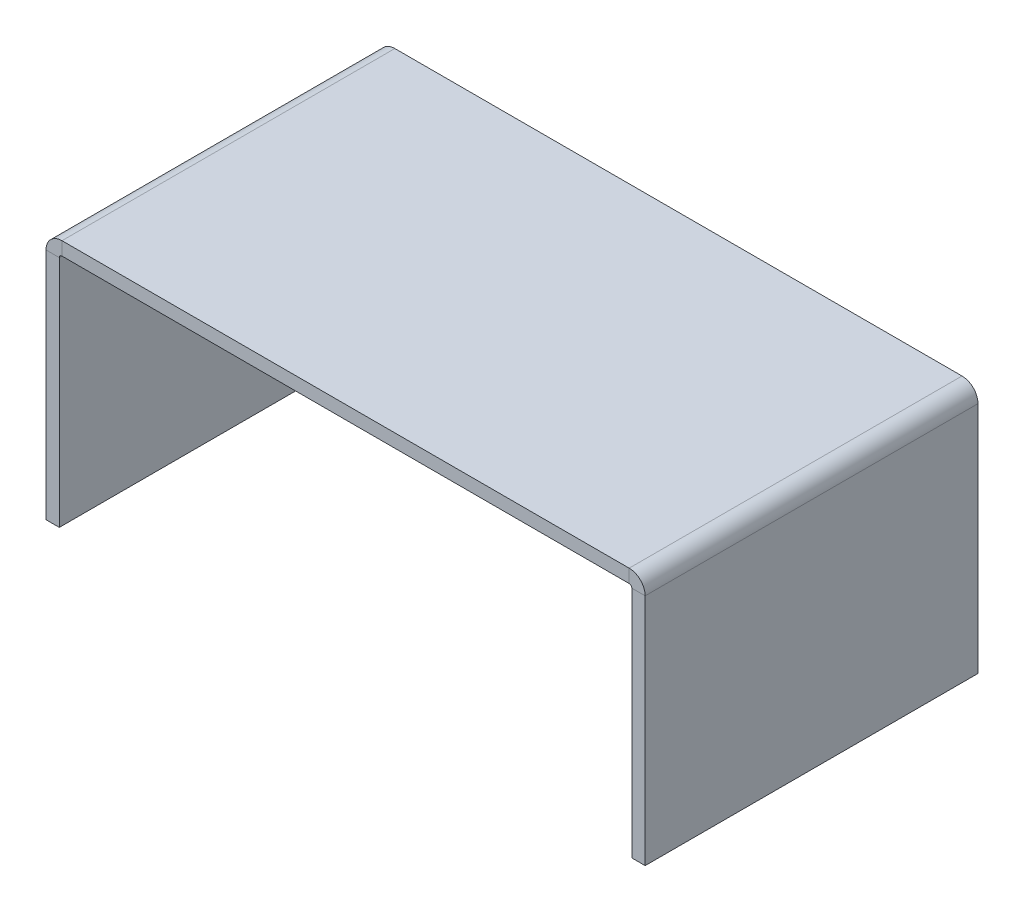
ISO-10303-21;
HEADER;
FILE_DESCRIPTION(('STEP AP214'),'2;1');
FILE_NAME('part.step','',(''),(''),'','','');
FILE_SCHEMA(('AUTOMOTIVE_DESIGN { 1 0 10303 214 1 1 1 1 }'));
ENDSEC;
DATA;
#1=APPLICATION_CONTEXT('core data for automotive mechanical design processes');
#2=APPLICATION_PROTOCOL_DEFINITION('international standard','automotive_design',2000,#1);
#3=PRODUCT_CONTEXT('',#1,'mechanical');
#4=PRODUCT('Part','Part','',(#3));
#5=PRODUCT_RELATED_PRODUCT_CATEGORY('part','',(#4));
#6=PRODUCT_DEFINITION_FORMATION('','',#4);
#7=PRODUCT_DEFINITION_CONTEXT('part definition',#1,'design');
#8=PRODUCT_DEFINITION('design','',#6,#7);
#9=PRODUCT_DEFINITION_SHAPE('','',#8);
#10=(LENGTH_UNIT() NAMED_UNIT(*) SI_UNIT(.MILLI.,.METRE.));
#11=(NAMED_UNIT(*) PLANE_ANGLE_UNIT() SI_UNIT($,.RADIAN.));
#12=(NAMED_UNIT(*) SI_UNIT($,.STERADIAN.) SOLID_ANGLE_UNIT());
#13=UNCERTAINTY_MEASURE_WITH_UNIT(LENGTH_MEASURE(1.E-05),#10,'distance_accuracy_value','');
#14=(GEOMETRIC_REPRESENTATION_CONTEXT(3) GLOBAL_UNCERTAINTY_ASSIGNED_CONTEXT((#13)) GLOBAL_UNIT_ASSIGNED_CONTEXT((#10,
#11,#12)) REPRESENTATION_CONTEXT('',''));
#15=CARTESIAN_POINT('',(0.,0.,0.));
#16=DIRECTION('',(0.,0.,1.));
#17=DIRECTION('',(1.,0.,0.));
#18=AXIS2_PLACEMENT_3D('',#15,#16,#17);
#19=CARTESIAN_POINT('',(4.8,75.,-100.));
#20=DIRECTION('',(0.,0.,-1.));
#21=DIRECTION('',(1.,0.,0.));
#22=AXIS2_PLACEMENT_3D('',#19,#20,#21);
#23=PLANE('',#22);
#24=DIRECTION('',(0.,-1.,0.));
#25=VECTOR('',#24,1.);
#26=CARTESIAN_POINT('',(4.8,75.,-100.));
#27=LINE('',#26,#25);
#28=CARTESIAN_POINT('',(4.8,75.,-100.));
#29=VERTEX_POINT('',#28);
#30=CARTESIAN_POINT('',(4.8,71.,-100.));
#31=VERTEX_POINT('',#30);
#32=EDGE_CURVE('E11',#29,#31,#27,.T.);
#33=ORIENTED_EDGE('',*,*,#32,.T.);
#34=CARTESIAN_POINT('',(4.8,70.2,-100.));
#35=DIRECTION('',(0.,0.,1.));
#36=DIRECTION('',(1.,0.,0.));
#37=AXIS2_PLACEMENT_3D('',#34,#35,#36);
#38=CIRCLE('',#37,0.8);
#39=CARTESIAN_POINT('',(4.,70.2,-100.));
#40=VERTEX_POINT('',#39);
#41=EDGE_CURVE('E152',#40,#31,#38,.F.);
#42=ORIENTED_EDGE('',*,*,#41,.F.);
#43=DIRECTION('',(-1.,0.,0.));
#44=VECTOR('',#43,1.);
#45=CARTESIAN_POINT('',(4.,70.2,-100.));
#46=LINE('',#45,#44);
#47=CARTESIAN_POINT('',(0.,70.2,-100.));
#48=VERTEX_POINT('',#47);
#49=EDGE_CURVE('E47',#40,#48,#46,.T.);
#50=ORIENTED_EDGE('',*,*,#49,.T.);
#51=CARTESIAN_POINT('',(4.8,70.2,-100.));
#52=DIRECTION('',(0.,0.,1.));
#53=DIRECTION('',(1.,0.,0.));
#54=AXIS2_PLACEMENT_3D('',#51,#52,#53);
#55=CIRCLE('',#54,4.8);
#56=EDGE_CURVE('E163',#48,#29,#55,.F.);
#57=ORIENTED_EDGE('',*,*,#56,.T.);
#58=EDGE_LOOP('',(#33,#42,#50,#57));
#59=FACE_BOUND('',#58,.T.);
#60=ADVANCED_FACE('F39',(#59),#23,.T.);
#61=CARTESIAN_POINT('',(4.,70.2,-100.));
#62=DIRECTION('',(0.,0.,-1.));
#63=DIRECTION('',(1.,0.,0.));
#64=AXIS2_PLACEMENT_3D('',#61,#62,#63);
#65=PLANE('',#64);
#66=DIRECTION('',(1.,0.,0.));
#67=VECTOR('',#66,1.);
#68=CARTESIAN_POINT('',(0.,75.,-100.));
#69=LINE('',#68,#67);
#70=CARTESIAN_POINT('',(175.2,75.,-100.));
#71=VERTEX_POINT('',#70);
#72=EDGE_CURVE('E167',#29,#71,#69,.T.);
#73=ORIENTED_EDGE('',*,*,#72,.T.);
#74=DIRECTION('',(0.,1.,0.));
#75=VECTOR('',#74,1.);
#76=CARTESIAN_POINT('',(175.2,71.,-100.));
#77=LINE('',#76,#75);
#78=CARTESIAN_POINT('',(175.2,71.,-100.));
#79=VERTEX_POINT('',#78);
#80=EDGE_CURVE('E150',#79,#71,#77,.T.);
#81=ORIENTED_EDGE('',*,*,#80,.F.);
#82=DIRECTION('',(1.,0.,0.));
#83=VECTOR('',#82,1.);
#84=CARTESIAN_POINT('',(0.,71.,-100.));
#85=LINE('',#84,#83);
#86=EDGE_CURVE('E136',#31,#79,#85,.T.);
#87=ORIENTED_EDGE('',*,*,#86,.F.);
#88=ORIENTED_EDGE('',*,*,#32,.F.);
#89=EDGE_LOOP('',(#73,#81,#87,#88));
#90=FACE_BOUND('',#89,.T.);
#91=ADVANCED_FACE('F148',(#90),#65,.T.);
#92=CARTESIAN_POINT('',(0.,70.2,0.));
#93=DIRECTION('',(0.,0.,1.));
#94=DIRECTION('',(-1.,0.,0.));
#95=AXIS2_PLACEMENT_3D('',#92,#93,#94);
#96=PLANE('',#95);
#97=DIRECTION('',(1.,0.,0.));
#98=VECTOR('',#97,1.);
#99=CARTESIAN_POINT('',(0.,70.2,0.));
#100=LINE('',#99,#98);
#101=CARTESIAN_POINT('',(0.,70.2,0.));
#102=VERTEX_POINT('',#101);
#103=CARTESIAN_POINT('',(4.,70.2,0.));
#104=VERTEX_POINT('',#103);
#105=EDGE_CURVE('E243',#102,#104,#100,.T.);
#106=ORIENTED_EDGE('',*,*,#105,.T.);
#107=CARTESIAN_POINT('',(4.8,70.2,0.));
#108=DIRECTION('',(0.,0.,1.));
#109=DIRECTION('',(1.,0.,0.));
#110=AXIS2_PLACEMENT_3D('',#107,#108,#109);
#111=CIRCLE('',#110,0.8);
#112=CARTESIAN_POINT('',(4.8,71.,0.));
#113=VERTEX_POINT('',#112);
#114=EDGE_CURVE('E203',#104,#113,#111,.F.);
#115=ORIENTED_EDGE('',*,*,#114,.T.);
#116=DIRECTION('',(0.,1.,0.));
#117=VECTOR('',#116,1.);
#118=CARTESIAN_POINT('',(4.8,71.,0.));
#119=LINE('',#118,#117);
#120=CARTESIAN_POINT('',(4.8,75.,0.));
#121=VERTEX_POINT('',#120);
#122=EDGE_CURVE('E240',#113,#121,#119,.T.);
#123=ORIENTED_EDGE('',*,*,#122,.T.);
#124=CARTESIAN_POINT('',(4.8,70.2,0.));
#125=DIRECTION('',(0.,0.,1.));
#126=DIRECTION('',(1.,0.,0.));
#127=AXIS2_PLACEMENT_3D('',#124,#125,#126);
#128=CIRCLE('',#127,4.8);
#129=EDGE_CURVE('E191',#102,#121,#128,.F.);
#130=ORIENTED_EDGE('',*,*,#129,.F.);
#131=EDGE_LOOP('',(#106,#115,#123,#130));
#132=FACE_BOUND('',#131,.T.);
#133=ADVANCED_FACE('F248',(#132),#96,.T.);
#134=CARTESIAN_POINT('',(4.8,71.,0.));
#135=DIRECTION('',(0.,0.,1.));
#136=DIRECTION('',(-1.,0.,0.));
#137=AXIS2_PLACEMENT_3D('',#134,#135,#136);
#138=PLANE('',#137);
#139=DIRECTION('',(0.,1.,0.));
#140=VECTOR('',#139,1.);
#141=CARTESIAN_POINT('',(0.,0.,0.));
#142=LINE('',#141,#140);
#143=CARTESIAN_POINT('',(0.,0.,0.));
#144=VERTEX_POINT('',#143);
#145=EDGE_CURVE('E194',#144,#102,#142,.T.);
#146=ORIENTED_EDGE('',*,*,#145,.F.);
#147=DIRECTION('',(-1.,0.,0.));
#148=VECTOR('',#147,1.);
#149=CARTESIAN_POINT('',(4.,0.,0.));
#150=LINE('',#149,#148);
#151=CARTESIAN_POINT('',(4.,0.,0.));
#152=VERTEX_POINT('',#151);
#153=EDGE_CURVE('E197',#152,#144,#150,.T.);
#154=ORIENTED_EDGE('',*,*,#153,.F.);
#155=DIRECTION('',(0.,1.,0.));
#156=VECTOR('',#155,1.);
#157=CARTESIAN_POINT('',(4.,0.,0.));
#158=LINE('',#157,#156);
#159=EDGE_CURVE('E200',#152,#104,#158,.T.);
#160=ORIENTED_EDGE('',*,*,#159,.T.);
#161=ORIENTED_EDGE('',*,*,#105,.F.);
#162=EDGE_LOOP('',(#146,#154,#160,#161));
#163=FACE_BOUND('',#162,.T.);
#164=ADVANCED_FACE('F251',(#163),#138,.T.);
#165=CARTESIAN_POINT('',(180.,70.2,-100.));
#166=DIRECTION('',(0.,0.,-1.));
#167=DIRECTION('',(1.,0.,0.));
#168=AXIS2_PLACEMENT_3D('',#165,#166,#167);
#169=PLANE('',#168);
#170=DIRECTION('',(-1.,0.,0.));
#171=VECTOR('',#170,1.);
#172=CARTESIAN_POINT('',(180.,70.2,-100.));
#173=LINE('',#172,#171);
#174=CARTESIAN_POINT('',(180.,70.2,-100.));
#175=VERTEX_POINT('',#174);
#176=CARTESIAN_POINT('',(176.,70.2,-100.));
#177=VERTEX_POINT('',#176);
#178=EDGE_CURVE('E237',#175,#177,#173,.T.);
#179=ORIENTED_EDGE('',*,*,#178,.T.);
#180=CARTESIAN_POINT('',(175.2,70.2,-100.));
#181=DIRECTION('',(0.,0.,1.));
#182=DIRECTION('',(1.,0.,0.));
#183=AXIS2_PLACEMENT_3D('',#180,#181,#182);
#184=CIRCLE('',#183,0.8);
#185=EDGE_CURVE('E151',#79,#177,#184,.F.);
#186=ORIENTED_EDGE('',*,*,#185,.F.);
#187=ORIENTED_EDGE('',*,*,#80,.T.);
#188=CARTESIAN_POINT('',(175.2,70.2,-100.));
#189=DIRECTION('',(0.,0.,1.));
#190=DIRECTION('',(1.,0.,0.));
#191=AXIS2_PLACEMENT_3D('',#188,#189,#190);
#192=CIRCLE('',#191,4.8);
#193=EDGE_CURVE('E171',#71,#175,#192,.F.);
#194=ORIENTED_EDGE('',*,*,#193,.T.);
#195=EDGE_LOOP('',(#179,#186,#187,#194));
#196=FACE_BOUND('',#195,.T.);
#197=ADVANCED_FACE('F286',(#196),#169,.T.);
#198=CARTESIAN_POINT('',(175.2,71.,-100.));
#199=DIRECTION('',(0.,0.,-1.));
#200=DIRECTION('',(1.,0.,0.));
#201=AXIS2_PLACEMENT_3D('',#198,#199,#200);
#202=PLANE('',#201);
#203=DIRECTION('',(0.,-1.,0.));
#204=VECTOR('',#203,1.);
#205=CARTESIAN_POINT('',(180.,75.,-100.));
#206=LINE('',#205,#204);
#207=CARTESIAN_POINT('',(180.,0.,-100.));
#208=VERTEX_POINT('',#207);
#209=EDGE_CURVE('E284',#175,#208,#206,.T.);
#210=ORIENTED_EDGE('',*,*,#209,.T.);
#211=DIRECTION('',(-1.,0.,0.));
#212=VECTOR('',#211,1.);
#213=CARTESIAN_POINT('',(180.,0.,-100.));
#214=LINE('',#213,#212);
#215=CARTESIAN_POINT('',(176.,0.,-100.));
#216=VERTEX_POINT('',#215);
#217=EDGE_CURVE('E519',#208,#216,#214,.T.);
#218=ORIENTED_EDGE('',*,*,#217,.T.);
#219=DIRECTION('',(0.,-1.,0.));
#220=VECTOR('',#219,1.);
#221=CARTESIAN_POINT('',(176.,75.,-100.));
#222=LINE('',#221,#220);
#223=EDGE_CURVE('E210',#177,#216,#222,.T.);
#224=ORIENTED_EDGE('',*,*,#223,.F.);
#225=ORIENTED_EDGE('',*,*,#178,.F.);
#226=EDGE_LOOP('',(#210,#218,#224,#225));
#227=FACE_BOUND('',#226,.T.);
#228=ADVANCED_FACE('F311',(#227),#202,.T.);
#229=CARTESIAN_POINT('',(175.2,75.,0.));
#230=DIRECTION('',(0.,0.,1.));
#231=DIRECTION('',(-1.,0.,0.));
#232=AXIS2_PLACEMENT_3D('',#229,#230,#231);
#233=PLANE('',#232);
#234=DIRECTION('',(0.,-1.,0.));
#235=VECTOR('',#234,1.);
#236=CARTESIAN_POINT('',(175.2,75.,0.));
#237=LINE('',#236,#235);
#238=CARTESIAN_POINT('',(175.2,75.,0.));
#239=VERTEX_POINT('',#238);
#240=CARTESIAN_POINT('',(175.2,71.,0.));
#241=VERTEX_POINT('',#240);
#242=EDGE_CURVE('E233',#239,#241,#237,.T.);
#243=ORIENTED_EDGE('',*,*,#242,.T.);
#244=CARTESIAN_POINT('',(175.2,70.2,0.));
#245=DIRECTION('',(0.,0.,1.));
#246=DIRECTION('',(1.,0.,0.));
#247=AXIS2_PLACEMENT_3D('',#244,#245,#246);
#248=CIRCLE('',#247,0.8);
#249=CARTESIAN_POINT('',(176.,70.2,0.));
#250=VERTEX_POINT('',#249);
#251=EDGE_CURVE('E207',#241,#250,#248,.F.);
#252=ORIENTED_EDGE('',*,*,#251,.T.);
#253=DIRECTION('',(1.,0.,0.));
#254=VECTOR('',#253,1.);
#255=CARTESIAN_POINT('',(176.,70.2,0.));
#256=LINE('',#255,#254);
#257=CARTESIAN_POINT('',(180.,70.2,0.));
#258=VERTEX_POINT('',#257);
#259=EDGE_CURVE('E230',#250,#258,#256,.T.);
#260=ORIENTED_EDGE('',*,*,#259,.T.);
#261=CARTESIAN_POINT('',(175.2,70.2,0.));
#262=DIRECTION('',(0.,0.,1.));
#263=DIRECTION('',(1.,0.,0.));
#264=AXIS2_PLACEMENT_3D('',#261,#262,#263);
#265=CIRCLE('',#264,4.8);
#266=EDGE_CURVE('E185',#239,#258,#265,.F.);
#267=ORIENTED_EDGE('',*,*,#266,.F.);
#268=EDGE_LOOP('',(#243,#252,#260,#267));
#269=FACE_BOUND('',#268,.T.);
#270=ADVANCED_FACE('F276',(#269),#233,.T.);
#271=CARTESIAN_POINT('',(176.,70.2,0.));
#272=DIRECTION('',(0.,0.,1.));
#273=DIRECTION('',(-1.,0.,0.));
#274=AXIS2_PLACEMENT_3D('',#271,#272,#273);
#275=PLANE('',#274);
#276=DIRECTION('',(1.,0.,0.));
#277=VECTOR('',#276,1.);
#278=CARTESIAN_POINT('',(0.,75.,0.));
#279=LINE('',#278,#277);
#280=EDGE_CURVE('E188',#121,#239,#279,.T.);
#281=ORIENTED_EDGE('',*,*,#280,.F.);
#282=ORIENTED_EDGE('',*,*,#122,.F.);
#283=DIRECTION('',(1.,0.,0.));
#284=VECTOR('',#283,1.);
#285=CARTESIAN_POINT('',(0.,71.,0.));
#286=LINE('',#285,#284);
#287=EDGE_CURVE('E138',#113,#241,#286,.T.);
#288=ORIENTED_EDGE('',*,*,#287,.T.);
#289=ORIENTED_EDGE('',*,*,#242,.F.);
#290=EDGE_LOOP('',(#281,#282,#288,#289));
#291=FACE_BOUND('',#290,.T.);
#292=ADVANCED_FACE('F269',(#291),#275,.T.);
#293=CARTESIAN_POINT('',(176.,75.,-100.));
#294=DIRECTION('',(1.,0.,0.));
#295=DIRECTION('',(0.,1.,0.));
#296=AXIS2_PLACEMENT_3D('',#293,#294,#295);
#297=PLANE('',#296);
#298=DIRECTION('',(0.,-1.,0.));
#299=VECTOR('',#298,1.);
#300=CARTESIAN_POINT('',(176.,75.,0.));
#301=LINE('',#300,#299);
#302=CARTESIAN_POINT('',(176.,0.,0.));
#303=VERTEX_POINT('',#302);
#304=EDGE_CURVE('E178',#250,#303,#301,.T.);
#305=ORIENTED_EDGE('',*,*,#304,.F.);
#306=DIRECTION('',(0.,0.,1.));
#307=VECTOR('',#306,1.);
#308=CARTESIAN_POINT('',(176.,70.2,-100.));
#309=LINE('',#308,#307);
#310=EDGE_CURVE('E55',#177,#250,#309,.T.);
#311=ORIENTED_EDGE('',*,*,#310,.F.);
#312=ORIENTED_EDGE('',*,*,#223,.T.);
#313=DIRECTION('',(0.,0.,1.));
#314=VECTOR('',#313,1.);
#315=CARTESIAN_POINT('',(176.,0.,-100.));
#316=LINE('',#315,#314);
#317=EDGE_CURVE('E108',#216,#303,#316,.T.);
#318=ORIENTED_EDGE('',*,*,#317,.T.);
#319=EDGE_LOOP('',(#305,#311,#312,#318));
#320=FACE_BOUND('',#319,.T.);
#321=ADVANCED_FACE('F319',(#320),#297,.F.);
#322=CARTESIAN_POINT('',(180.,0.,-100.));
#323=DIRECTION('',(0.,-1.,0.));
#324=DIRECTION('',(0.,0.,1.));
#325=AXIS2_PLACEMENT_3D('',#322,#323,#324);
#326=PLANE('',#325);
#327=DIRECTION('',(-1.,0.,0.));
#328=VECTOR('',#327,1.);
#329=CARTESIAN_POINT('',(180.,0.,0.));
#330=LINE('',#329,#328);
#331=CARTESIAN_POINT('',(180.,0.,0.));
#332=VERTEX_POINT('',#331);
#333=EDGE_CURVE('E181',#332,#303,#330,.T.);
#334=ORIENTED_EDGE('',*,*,#333,.T.);
#335=ORIENTED_EDGE('',*,*,#317,.F.);
#336=ORIENTED_EDGE('',*,*,#217,.F.);
#337=DIRECTION('',(0.,0.,1.));
#338=VECTOR('',#337,1.);
#339=CARTESIAN_POINT('',(180.,0.,-100.));
#340=LINE('',#339,#338);
#341=EDGE_CURVE('E226',#208,#332,#340,.T.);
#342=ORIENTED_EDGE('',*,*,#341,.T.);
#343=EDGE_LOOP('',(#334,#335,#336,#342));
#344=FACE_BOUND('',#343,.T.);
#345=ADVANCED_FACE('F322',(#344),#326,.T.);
#346=CARTESIAN_POINT('',(180.,75.,-100.));
#347=DIRECTION('',(1.,0.,0.));
#348=DIRECTION('',(0.,1.,0.));
#349=AXIS2_PLACEMENT_3D('',#346,#347,#348);
#350=PLANE('',#349);
#351=DIRECTION('',(0.,-1.,0.));
#352=VECTOR('',#351,1.);
#353=CARTESIAN_POINT('',(180.,75.,0.));
#354=LINE('',#353,#352);
#355=EDGE_CURVE('E183',#258,#332,#354,.T.);
#356=ORIENTED_EDGE('',*,*,#355,.T.);
#357=ORIENTED_EDGE('',*,*,#341,.F.);
#358=ORIENTED_EDGE('',*,*,#209,.F.);
#359=DIRECTION('',(0.,0.,1.));
#360=VECTOR('',#359,1.);
#361=CARTESIAN_POINT('',(180.,70.2,-100.));
#362=LINE('',#361,#360);
#363=EDGE_CURVE('E224',#175,#258,#362,.T.);
#364=ORIENTED_EDGE('',*,*,#363,.T.);
#365=EDGE_LOOP('',(#356,#357,#358,#364));
#366=FACE_BOUND('',#365,.T.);
#367=ADVANCED_FACE('F325',(#366),#350,.T.);
#368=CARTESIAN_POINT('',(175.2,70.2,-100.));
#369=DIRECTION('',(0.,0.,1.));
#370=DIRECTION('',(-1.,0.,0.));
#371=AXIS2_PLACEMENT_3D('',#368,#369,#370);
#372=CYLINDRICAL_SURFACE('',#371,4.8);
#373=ORIENTED_EDGE('',*,*,#266,.T.);
#374=ORIENTED_EDGE('',*,*,#363,.F.);
#375=ORIENTED_EDGE('',*,*,#193,.F.);
#376=DIRECTION('',(0.,0.,1.));
#377=VECTOR('',#376,1.);
#378=CARTESIAN_POINT('',(175.2,75.,-100.));
#379=LINE('',#378,#377);
#380=EDGE_CURVE('E222',#71,#239,#379,.T.);
#381=ORIENTED_EDGE('',*,*,#380,.T.);
#382=EDGE_LOOP('',(#373,#374,#375,#381));
#383=FACE_BOUND('',#382,.T.);
#384=ADVANCED_FACE('F279',(#383),#372,.T.);
#385=CARTESIAN_POINT('',(0.,75.,-100.));
#386=DIRECTION('',(0.,1.,0.));
#387=DIRECTION('',(0.,0.,-1.));
#388=AXIS2_PLACEMENT_3D('',#385,#386,#387);
#389=PLANE('',#388);
#390=ORIENTED_EDGE('',*,*,#280,.T.);
#391=ORIENTED_EDGE('',*,*,#380,.F.);
#392=ORIENTED_EDGE('',*,*,#72,.F.);
#393=DIRECTION('',(0.,0.,1.));
#394=VECTOR('',#393,1.);
#395=CARTESIAN_POINT('',(4.8,75.,-100.));
#396=LINE('',#395,#394);
#397=EDGE_CURVE('E220',#29,#121,#396,.T.);
#398=ORIENTED_EDGE('',*,*,#397,.T.);
#399=EDGE_LOOP('',(#390,#391,#392,#398));
#400=FACE_BOUND('',#399,.T.);
#401=ADVANCED_FACE('F273',(#400),#389,.T.);
#402=CARTESIAN_POINT('',(4.8,70.2,-100.));
#403=DIRECTION('',(0.,0.,1.));
#404=DIRECTION('',(-1.,0.,0.));
#405=AXIS2_PLACEMENT_3D('',#402,#403,#404);
#406=CYLINDRICAL_SURFACE('',#405,4.8);
#407=ORIENTED_EDGE('',*,*,#129,.T.);
#408=ORIENTED_EDGE('',*,*,#397,.F.);
#409=ORIENTED_EDGE('',*,*,#56,.F.);
#410=DIRECTION('',(0.,0.,1.));
#411=VECTOR('',#410,1.);
#412=CARTESIAN_POINT('',(0.,70.2,-100.));
#413=LINE('',#412,#411);
#414=EDGE_CURVE('E218',#48,#102,#413,.T.);
#415=ORIENTED_EDGE('',*,*,#414,.T.);
#416=EDGE_LOOP('',(#407,#408,#409,#415));
#417=FACE_BOUND('',#416,.T.);
#418=ADVANCED_FACE('F265',(#417),#406,.T.);
#419=CARTESIAN_POINT('',(0.,0.,-100.));
#420=DIRECTION('',(-1.,0.,0.));
#421=DIRECTION('',(0.,0.,-1.));
#422=AXIS2_PLACEMENT_3D('',#419,#420,#421);
#423=PLANE('',#422);
#424=ORIENTED_EDGE('',*,*,#145,.T.);
#425=ORIENTED_EDGE('',*,*,#414,.F.);
#426=DIRECTION('',(0.,1.,0.));
#427=VECTOR('',#426,1.);
#428=CARTESIAN_POINT('',(0.,0.,-100.));
#429=LINE('',#428,#427);
#430=CARTESIAN_POINT('',(0.,0.,-100.));
#431=VERTEX_POINT('',#430);
#432=EDGE_CURVE('E166',#431,#48,#429,.T.);
#433=ORIENTED_EDGE('',*,*,#432,.F.);
#434=DIRECTION('',(0.,0.,1.));
#435=VECTOR('',#434,1.);
#436=CARTESIAN_POINT('',(0.,0.,-100.));
#437=LINE('',#436,#435);
#438=EDGE_CURVE('E216',#431,#144,#437,.T.);
#439=ORIENTED_EDGE('',*,*,#438,.T.);
#440=EDGE_LOOP('',(#424,#425,#433,#439));
#441=FACE_BOUND('',#440,.T.);
#442=ADVANCED_FACE('F264',(#441),#423,.T.);
#443=CARTESIAN_POINT('',(4.,0.,-100.));
#444=DIRECTION('',(0.,-1.,0.));
#445=DIRECTION('',(0.,0.,1.));
#446=AXIS2_PLACEMENT_3D('',#443,#444,#445);
#447=PLANE('',#446);
#448=ORIENTED_EDGE('',*,*,#153,.T.);
#449=ORIENTED_EDGE('',*,*,#438,.F.);
#450=DIRECTION('',(-1.,0.,0.));
#451=VECTOR('',#450,1.);
#452=CARTESIAN_POINT('',(4.,0.,-100.));
#453=LINE('',#452,#451);
#454=CARTESIAN_POINT('',(4.,0.,-100.));
#455=VERTEX_POINT('',#454);
#456=EDGE_CURVE('E169',#455,#431,#453,.T.);
#457=ORIENTED_EDGE('',*,*,#456,.F.);
#458=DIRECTION('',(0.,0.,1.));
#459=VECTOR('',#458,1.);
#460=CARTESIAN_POINT('',(4.,0.,-100.));
#461=LINE('',#460,#459);
#462=EDGE_CURVE('E214',#455,#152,#461,.T.);
#463=ORIENTED_EDGE('',*,*,#462,.T.);
#464=EDGE_LOOP('',(#448,#449,#457,#463));
#465=FACE_BOUND('',#464,.T.);
#466=ADVANCED_FACE('F337',(#465),#447,.T.);
#467=CARTESIAN_POINT('',(4.,0.,-100.));
#468=DIRECTION('',(-1.,0.,0.));
#469=DIRECTION('',(0.,0.,-1.));
#470=AXIS2_PLACEMENT_3D('',#467,#468,#469);
#471=PLANE('',#470);
#472=ORIENTED_EDGE('',*,*,#159,.F.);
#473=ORIENTED_EDGE('',*,*,#462,.F.);
#474=DIRECTION('',(0.,1.,0.));
#475=VECTOR('',#474,1.);
#476=CARTESIAN_POINT('',(4.,0.,-100.));
#477=LINE('',#476,#475);
#478=EDGE_CURVE('E159',#455,#40,#477,.T.);
#479=ORIENTED_EDGE('',*,*,#478,.T.);
#480=DIRECTION('',(0.,0.,1.));
#481=VECTOR('',#480,1.);
#482=CARTESIAN_POINT('',(4.,70.2,-100.));
#483=LINE('',#482,#481);
#484=EDGE_CURVE('E143',#40,#104,#483,.T.);
#485=ORIENTED_EDGE('',*,*,#484,.T.);
#486=EDGE_LOOP('',(#472,#473,#479,#485));
#487=FACE_BOUND('',#486,.T.);
#488=ADVANCED_FACE('F256',(#487),#471,.F.);
#489=CARTESIAN_POINT('',(4.8,70.2,-100.));
#490=DIRECTION('',(0.,0.,1.));
#491=DIRECTION('',(-1.,0.,0.));
#492=AXIS2_PLACEMENT_3D('',#489,#490,#491);
#493=CYLINDRICAL_SURFACE('',#492,0.8);
#494=ORIENTED_EDGE('',*,*,#114,.F.);
#495=ORIENTED_EDGE('',*,*,#484,.F.);
#496=ORIENTED_EDGE('',*,*,#41,.T.);
#497=DIRECTION('',(0.,0.,1.));
#498=VECTOR('',#497,1.);
#499=CARTESIAN_POINT('',(4.8,71.,-100.));
#500=LINE('',#499,#498);
#501=EDGE_CURVE('E133',#31,#113,#500,.T.);
#502=ORIENTED_EDGE('',*,*,#501,.T.);
#503=EDGE_LOOP('',(#494,#495,#496,#502));
#504=FACE_BOUND('',#503,.T.);
#505=ADVANCED_FACE('F155',(#504),#493,.F.);
#506=CARTESIAN_POINT('',(0.,71.,-100.));
#507=DIRECTION('',(0.,1.,0.));
#508=DIRECTION('',(0.,0.,-1.));
#509=AXIS2_PLACEMENT_3D('',#506,#507,#508);
#510=PLANE('',#509);
#511=ORIENTED_EDGE('',*,*,#287,.F.);
#512=ORIENTED_EDGE('',*,*,#501,.F.);
#513=ORIENTED_EDGE('',*,*,#86,.T.);
#514=DIRECTION('',(0.,0.,1.));
#515=VECTOR('',#514,1.);
#516=CARTESIAN_POINT('',(175.2,71.,-100.));
#517=LINE('',#516,#515);
#518=EDGE_CURVE('E96',#79,#241,#517,.T.);
#519=ORIENTED_EDGE('',*,*,#518,.T.);
#520=EDGE_LOOP('',(#511,#512,#513,#519));
#521=FACE_BOUND('',#520,.T.);
#522=ADVANCED_FACE('F135',(#521),#510,.F.);
#523=CARTESIAN_POINT('',(175.2,70.2,-100.));
#524=DIRECTION('',(0.,0.,1.));
#525=DIRECTION('',(-1.,0.,0.));
#526=AXIS2_PLACEMENT_3D('',#523,#524,#525);
#527=CYLINDRICAL_SURFACE('',#526,0.8);
#528=ORIENTED_EDGE('',*,*,#251,.F.);
#529=ORIENTED_EDGE('',*,*,#518,.F.);
#530=ORIENTED_EDGE('',*,*,#185,.T.);
#531=ORIENTED_EDGE('',*,*,#310,.T.);
#532=EDGE_LOOP('',(#528,#529,#530,#531));
#533=FACE_BOUND('',#532,.T.);
#534=ADVANCED_FACE('F287',(#533),#527,.F.);
#535=CARTESIAN_POINT('',(175.2,70.2,-100.));
#536=DIRECTION('',(0.,0.,-1.));
#537=DIRECTION('',(1.,0.,0.));
#538=AXIS2_PLACEMENT_3D('',#535,#536,#537);
#539=PLANE('',#538);
#540=ORIENTED_EDGE('',*,*,#478,.F.);
#541=ORIENTED_EDGE('',*,*,#456,.T.);
#542=ORIENTED_EDGE('',*,*,#432,.T.);
#543=ORIENTED_EDGE('',*,*,#49,.F.);
#544=EDGE_LOOP('',(#540,#541,#542,#543));
#545=FACE_BOUND('',#544,.T.);
#546=ADVANCED_FACE('F259',(#545),#539,.T.);
#547=CARTESIAN_POINT('',(175.2,70.2,0.));
#548=DIRECTION('',(0.,0.,-1.));
#549=DIRECTION('',(1.,0.,0.));
#550=AXIS2_PLACEMENT_3D('',#547,#548,#549);
#551=PLANE('',#550);
#552=ORIENTED_EDGE('',*,*,#304,.T.);
#553=ORIENTED_EDGE('',*,*,#333,.F.);
#554=ORIENTED_EDGE('',*,*,#355,.F.);
#555=ORIENTED_EDGE('',*,*,#259,.F.);
#556=EDGE_LOOP('',(#552,#553,#554,#555));
#557=FACE_BOUND('',#556,.T.);
#558=ADVANCED_FACE('F294',(#557),#551,.F.);
#559=CLOSED_SHELL('',(#60,#91,#133,#164,#197,#228,#270,#292,#321,#345,#367,#384,#401,#418,#442,
#466,#488,#505,#522,#534,#546,#558));
#560=MANIFOLD_SOLID_BREP('B2',#559);
#561=ADVANCED_BREP_SHAPE_REPRESENTATION('',(#18,#560),#14);
#562=SHAPE_DEFINITION_REPRESENTATION(#9,#561);
ENDSEC;
END-ISO-10303-21;
